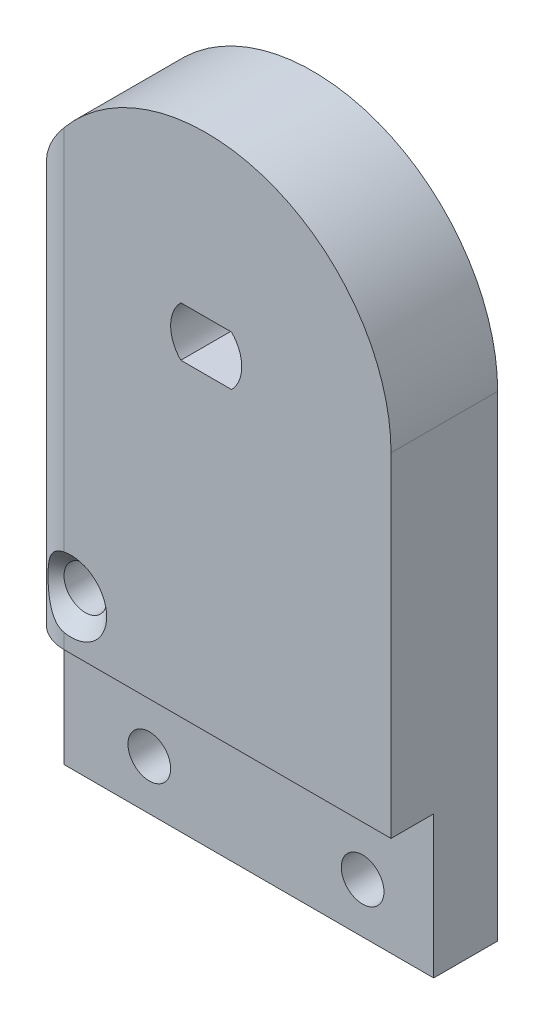
ISO-10303-21;
HEADER;
FILE_DESCRIPTION(('STEP AP214'),'2;1');
FILE_NAME('part.step','',(''),(''),'','','');
FILE_SCHEMA(('AUTOMOTIVE_DESIGN { 1 0 10303 214 1 1 1 1 }'));
ENDSEC;
DATA;
#1=APPLICATION_CONTEXT('core data for automotive mechanical design processes');
#2=APPLICATION_PROTOCOL_DEFINITION('international standard','automotive_design',2000,#1);
#3=PRODUCT_CONTEXT('',#1,'mechanical');
#4=PRODUCT('Part','Part','',(#3));
#5=PRODUCT_RELATED_PRODUCT_CATEGORY('part','',(#4));
#6=PRODUCT_DEFINITION_FORMATION('','',#4);
#7=PRODUCT_DEFINITION_CONTEXT('part definition',#1,'design');
#8=PRODUCT_DEFINITION('design','',#6,#7);
#9=PRODUCT_DEFINITION_SHAPE('','',#8);
#10=(LENGTH_UNIT() NAMED_UNIT(*) SI_UNIT(.MILLI.,.METRE.));
#11=(NAMED_UNIT(*) PLANE_ANGLE_UNIT() SI_UNIT($,.RADIAN.));
#12=(NAMED_UNIT(*) SI_UNIT($,.STERADIAN.) SOLID_ANGLE_UNIT());
#13=UNCERTAINTY_MEASURE_WITH_UNIT(LENGTH_MEASURE(1.E-05),#10,'distance_accuracy_value','');
#14=(GEOMETRIC_REPRESENTATION_CONTEXT(3) GLOBAL_UNCERTAINTY_ASSIGNED_CONTEXT((#13)) GLOBAL_UNIT_ASSIGNED_CONTEXT((#10,
#11,#12)) REPRESENTATION_CONTEXT('',''));
#15=CARTESIAN_POINT('',(0.,0.,0.));
#16=DIRECTION('',(0.,0.,1.));
#17=DIRECTION('',(1.,0.,0.));
#18=AXIS2_PLACEMENT_3D('',#15,#16,#17);
#19=CARTESIAN_POINT('',(24.2641007815364,-54.,8.));
#20=DIRECTION('',(0.,1.,0.));
#21=DIRECTION('',(0.,0.,1.));
#22=AXIS2_PLACEMENT_3D('',#19,#20,#21);
#23=PLANE('',#22);
#24=DIRECTION('',(0.,0.,-1.));
#25=VECTOR('',#24,1.);
#26=CARTESIAN_POINT('',(24.2641007815364,-54.,8.));
#27=LINE('',#26,#25);
#28=CARTESIAN_POINT('',(24.2641007815364,-54.,5.));
#29=VERTEX_POINT('',#28);
#30=CARTESIAN_POINT('',(24.2641007815364,-54.,0.5));
#31=VERTEX_POINT('',#30);
#32=EDGE_CURVE('E144',#29,#31,#27,.T.);
#33=ORIENTED_EDGE('',*,*,#32,.T.);
#34=DIRECTION('',(1.,0.,0.));
#35=VECTOR('',#34,1.);
#36=CARTESIAN_POINT('',(24.2641007815364,-54.,0.5));
#37=LINE('',#36,#35);
#38=CARTESIAN_POINT('',(50.2641007815363,-54.,0.5));
#39=VERTEX_POINT('',#38);
#40=EDGE_CURVE('E130',#31,#39,#37,.T.);
#41=ORIENTED_EDGE('',*,*,#40,.T.);
#42=DIRECTION('',(0.,0.,-1.));
#43=VECTOR('',#42,1.);
#44=CARTESIAN_POINT('',(50.2641007815364,-54.,8.));
#45=LINE('',#44,#43);
#46=CARTESIAN_POINT('',(50.2641007815364,-54.,5.));
#47=VERTEX_POINT('',#46);
#48=EDGE_CURVE('E142',#47,#39,#45,.T.);
#49=ORIENTED_EDGE('',*,*,#48,.F.);
#50=DIRECTION('',(1.,0.,0.));
#51=VECTOR('',#50,1.);
#52=CARTESIAN_POINT('',(50.2641007815364,-54.,5.));
#53=LINE('',#52,#51);
#54=EDGE_CURVE('E252',#29,#47,#53,.T.);
#55=ORIENTED_EDGE('',*,*,#54,.F.);
#56=EDGE_LOOP('',(#33,#41,#49,#55));
#57=FACE_BOUND('',#56,.T.);
#58=ADVANCED_FACE('F37',(#57),#23,.F.);
#59=CARTESIAN_POINT('',(50.2641007815364,-54.,8.));
#60=DIRECTION('',(-1.,0.,0.));
#61=DIRECTION('',(0.,0.,1.));
#62=AXIS2_PLACEMENT_3D('',#59,#60,#61);
#63=PLANE('',#62);
#64=ORIENTED_EDGE('',*,*,#48,.T.);
#65=DIRECTION('',(0.,-1.,0.));
#66=VECTOR('',#65,1.);
#67=CARTESIAN_POINT('',(50.2641007815364,-4.,0.5));
#68=LINE('',#67,#66);
#69=CARTESIAN_POINT('',(50.2641007815364,-20.5159979477303,0.5));
#70=VERTEX_POINT('',#69);
#71=EDGE_CURVE('E125',#70,#39,#68,.T.);
#72=ORIENTED_EDGE('',*,*,#71,.F.);
#73=DIRECTION('',(0.,0.,1.));
#74=VECTOR('',#73,1.);
#75=CARTESIAN_POINT('',(50.2641007815364,-20.5159979477303,-62.5689387206191));
#76=LINE('',#75,#74);
#77=CARTESIAN_POINT('',(50.2641007815364,-20.5159979477303,8.));
#78=VERTEX_POINT('',#77);
#79=EDGE_CURVE('E244',#70,#78,#76,.T.);
#80=ORIENTED_EDGE('',*,*,#79,.T.);
#81=DIRECTION('',(0.,1.,0.));
#82=VECTOR('',#81,1.);
#83=CARTESIAN_POINT('',(50.2641007815364,-54.,8.));
#84=LINE('',#83,#82);
#85=CARTESIAN_POINT('',(50.2641007815364,-44.,8.));
#86=VERTEX_POINT('',#85);
#87=EDGE_CURVE('E153',#86,#78,#84,.T.);
#88=ORIENTED_EDGE('',*,*,#87,.F.);
#89=DIRECTION('',(0.,0.,1.));
#90=VECTOR('',#89,1.);
#91=CARTESIAN_POINT('',(50.2641007815364,-44.,5.));
#92=LINE('',#91,#90);
#93=CARTESIAN_POINT('',(50.2641007815364,-44.,5.));
#94=VERTEX_POINT('',#93);
#95=EDGE_CURVE('E248',#94,#86,#92,.T.);
#96=ORIENTED_EDGE('',*,*,#95,.F.);
#97=DIRECTION('',(0.,1.,0.));
#98=VECTOR('',#97,1.);
#99=CARTESIAN_POINT('',(50.2641007815364,-54.,5.));
#100=LINE('',#99,#98);
#101=EDGE_CURVE('E152',#47,#94,#100,.T.);
#102=ORIENTED_EDGE('',*,*,#101,.F.);
#103=EDGE_LOOP('',(#64,#72,#80,#88,#96,#102));
#104=FACE_BOUND('',#103,.T.);
#105=ADVANCED_FACE('F149',(#104),#63,.F.);
#106=CARTESIAN_POINT('',(24.2641007815364,-54.,8.));
#107=DIRECTION('',(1.,0.,0.));
#108=DIRECTION('',(0.,1.,0.));
#109=AXIS2_PLACEMENT_3D('',#106,#107,#108);
#110=PLANE('',#109);
#111=DIRECTION('',(0.,1.,0.));
#112=VECTOR('',#111,1.);
#113=CARTESIAN_POINT('',(24.2641007815364,-37.,0.5));
#114=LINE('',#113,#112);
#115=CARTESIAN_POINT('',(24.2641007815364,-20.5159979477303,0.5));
#116=VERTEX_POINT('',#115);
#117=EDGE_CURVE('E137',#31,#116,#114,.T.);
#118=ORIENTED_EDGE('',*,*,#117,.F.);
#119=ORIENTED_EDGE('',*,*,#32,.F.);
#120=DIRECTION('',(0.,-1.,0.));
#121=VECTOR('',#120,1.);
#122=CARTESIAN_POINT('',(24.2641007815364,-54.,5.));
#123=LINE('',#122,#121);
#124=CARTESIAN_POINT('',(24.2641007815364,-44.,5.));
#125=VERTEX_POINT('',#124);
#126=EDGE_CURVE('E164',#29,#125,#123,.F.);
#127=ORIENTED_EDGE('',*,*,#126,.T.);
#128=CARTESIAN_POINT('',(24.2641007815364,-20.5159979477303,5.));
#129=VERTEX_POINT('',#128);
#130=EDGE_CURVE('E163',#125,#129,#123,.F.);
#131=ORIENTED_EDGE('',*,*,#130,.T.);
#132=DIRECTION('',(0.,0.,1.));
#133=VECTOR('',#132,1.);
#134=CARTESIAN_POINT('',(24.2641007815364,-20.5159979477303,-62.5689387206191));
#135=LINE('',#134,#133);
#136=EDGE_CURVE('E241',#116,#129,#135,.T.);
#137=ORIENTED_EDGE('',*,*,#136,.F.);
#138=EDGE_LOOP('',(#118,#119,#127,#131,#137));
#139=FACE_BOUND('',#138,.T.);
#140=ADVANCED_FACE('F228',(#139),#110,.F.);
#141=CARTESIAN_POINT('',(30.2641007815364,-50.5,-32.2426406871193));
#142=DIRECTION('',(0.,0.,1.));
#143=DIRECTION('',(1.,0.,0.));
#144=AXIS2_PLACEMENT_3D('',#141,#142,#143);
#145=CYLINDRICAL_SURFACE('',#144,1.5);
#146=CARTESIAN_POINT('',(30.2641007815364,-50.5,0.5));
#147=DIRECTION('',(0.,0.,1.));
#148=DIRECTION('',(1.,0.,0.));
#149=AXIS2_PLACEMENT_3D('',#146,#147,#148);
#150=CIRCLE('',#149,1.5);
#151=CARTESIAN_POINT('',(31.7641007815364,-50.5,0.5));
#152=VERTEX_POINT('',#151);
#153=EDGE_CURVE('E146',#152,#152,#150,.F.);
#154=ORIENTED_EDGE('',*,*,#153,.T.);
#155=EDGE_LOOP('',(#154));
#156=FACE_BOUND('',#155,.T.);
#157=CARTESIAN_POINT('',(30.2641007815364,-50.5,5.));
#158=DIRECTION('',(0.,0.,1.));
#159=DIRECTION('',(1.,0.,0.));
#160=AXIS2_PLACEMENT_3D('',#157,#158,#159);
#161=CIRCLE('',#160,1.5);
#162=CARTESIAN_POINT('',(31.7641007815364,-50.5,5.));
#163=VERTEX_POINT('',#162);
#164=EDGE_CURVE('E145',#163,#163,#161,.T.);
#165=ORIENTED_EDGE('',*,*,#164,.T.);
#166=EDGE_LOOP('',(#165));
#167=FACE_BOUND('',#166,.T.);
#168=ADVANCED_FACE('F230',(#156,#167),#145,.F.);
#169=CARTESIAN_POINT('',(45.2641007815364,-50.5,-32.2426406871193));
#170=DIRECTION('',(0.,0.,1.));
#171=DIRECTION('',(1.,0.,0.));
#172=AXIS2_PLACEMENT_3D('',#169,#170,#171);
#173=CYLINDRICAL_SURFACE('',#172,1.50000000000001);
#174=CARTESIAN_POINT('',(45.2641007815364,-50.5,0.5));
#175=DIRECTION('',(0.,0.,1.));
#176=DIRECTION('',(1.,0.,0.));
#177=AXIS2_PLACEMENT_3D('',#174,#175,#176);
#178=CIRCLE('',#177,1.50000000000001);
#179=CARTESIAN_POINT('',(46.7641007815364,-50.5,0.5));
#180=VERTEX_POINT('',#179);
#181=EDGE_CURVE('E267',#180,#180,#178,.F.);
#182=ORIENTED_EDGE('',*,*,#181,.T.);
#183=EDGE_LOOP('',(#182));
#184=FACE_BOUND('',#183,.T.);
#185=CARTESIAN_POINT('',(45.2641007815364,-50.5,5.));
#186=DIRECTION('',(0.,0.,1.));
#187=DIRECTION('',(1.,0.,0.));
#188=AXIS2_PLACEMENT_3D('',#185,#186,#187);
#189=CIRCLE('',#188,1.50000000000001);
#190=CARTESIAN_POINT('',(46.7641007815364,-50.5,5.));
#191=VERTEX_POINT('',#190);
#192=EDGE_CURVE('E256',#191,#191,#189,.T.);
#193=ORIENTED_EDGE('',*,*,#192,.T.);
#194=EDGE_LOOP('',(#193));
#195=FACE_BOUND('',#194,.T.);
#196=ADVANCED_FACE('F236',(#184,#195),#173,.F.);
#197=CARTESIAN_POINT('',(27.7641007815364,-40.5,-32.2426406871193));
#198=DIRECTION('',(0.,0.,1.));
#199=DIRECTION('',(1.,0.,0.));
#200=AXIS2_PLACEMENT_3D('',#197,#198,#199);
#201=CYLINDRICAL_SURFACE('',#200,1.5);
#202=CARTESIAN_POINT('',(27.7641007815364,-40.5,0.5));
#203=DIRECTION('',(0.,0.,1.));
#204=DIRECTION('',(1.,0.,0.));
#205=AXIS2_PLACEMENT_3D('',#202,#203,#204);
#206=CIRCLE('',#205,1.5);
#207=CARTESIAN_POINT('',(29.2641007815364,-40.5,0.5));
#208=VERTEX_POINT('',#207);
#209=EDGE_CURVE('E43',#208,#208,#206,.F.);
#210=ORIENTED_EDGE('',*,*,#209,.T.);
#211=EDGE_LOOP('',(#210));
#212=FACE_BOUND('',#211,.T.);
#213=CARTESIAN_POINT('',(27.7641007815364,-40.5,7.00000000000001));
#214=DIRECTION('',(0.,0.,-1.));
#215=DIRECTION('',(-1.,0.,0.));
#216=AXIS2_PLACEMENT_3D('',#213,#214,#215);
#217=CIRCLE('',#216,1.5);
#218=CARTESIAN_POINT('',(26.2641007815364,-40.5,7.00000000000001));
#219=VERTEX_POINT('',#218);
#220=EDGE_CURVE('E173',#219,#219,#217,.F.);
#221=ORIENTED_EDGE('',*,*,#220,.T.);
#222=EDGE_LOOP('',(#221));
#223=FACE_BOUND('',#222,.T.);
#224=ADVANCED_FACE('F225',(#212,#223),#201,.F.);
#225=CARTESIAN_POINT('',(0.,0.,8.));
#226=DIRECTION('',(0.,0.,-1.));
#227=DIRECTION('',(-1.,0.,0.));
#228=AXIS2_PLACEMENT_3D('',#225,#226,#227);
#229=PLANE('',#228);
#230=CARTESIAN_POINT('',(37.2641007815364,-20.5159979477303,8.));
#231=DIRECTION('',(0.,0.,1.));
#232=DIRECTION('',(1.,0.,0.));
#233=AXIS2_PLACEMENT_3D('',#230,#231,#232);
#234=CIRCLE('',#233,2.5000000003716);
#235=CARTESIAN_POINT('',(39.0494578886773,-22.2659979482559,8.));
#236=VERTEX_POINT('',#235);
#237=CARTESIAN_POINT('',(39.0494578889322,-18.7659979474649,8.));
#238=VERTEX_POINT('',#237);
#239=EDGE_CURVE('E426',#236,#238,#234,.T.);
#240=ORIENTED_EDGE('',*,*,#239,.F.);
#241=DIRECTION('',(1.,0.,0.));
#242=VECTOR('',#241,1.);
#243=CARTESIAN_POINT('',(39.0494578886773,-22.2659979482559,8.));
#244=LINE('',#243,#242);
#245=CARTESIAN_POINT('',(35.4787436749158,-22.2659979482559,8.));
#246=VERTEX_POINT('',#245);
#247=EDGE_CURVE('E428',#246,#236,#244,.T.);
#248=ORIENTED_EDGE('',*,*,#247,.F.);
#249=CARTESIAN_POINT('',(37.2641007815364,-20.5159979477303,8.));
#250=DIRECTION('',(0.,0.,1.));
#251=DIRECTION('',(1.,0.,0.));
#252=AXIS2_PLACEMENT_3D('',#249,#250,#251);
#253=CIRCLE('',#252,2.50000000000003);
#254=CARTESIAN_POINT('',(35.4787436746608,-18.7659979474649,8.));
#255=VERTEX_POINT('',#254);
#256=EDGE_CURVE('E435',#255,#246,#253,.T.);
#257=ORIENTED_EDGE('',*,*,#256,.F.);
#258=DIRECTION('',(-1.,0.,0.));
#259=VECTOR('',#258,1.);
#260=CARTESIAN_POINT('',(35.4787436746608,-18.7659979474649,8.));
#261=LINE('',#260,#259);
#262=EDGE_CURVE('E429',#238,#255,#261,.T.);
#263=ORIENTED_EDGE('',*,*,#262,.F.);
#264=EDGE_LOOP('',(#240,#248,#257,#263));
#265=FACE_BOUND('',#264,.T.);
#266=DIRECTION('',(0.,-1.,0.));
#267=VECTOR('',#266,1.);
#268=CARTESIAN_POINT('',(27.2641007815364,0.,8.));
#269=LINE('',#268,#267);
#270=CARTESIAN_POINT('',(27.2641007815364,-12.2093740848123,8.));
#271=VERTEX_POINT('',#270);
#272=CARTESIAN_POINT('',(27.2641007815364,-38.0505102572168,8.));
#273=VERTEX_POINT('',#272);
#274=EDGE_CURVE('E161',#271,#273,#269,.T.);
#275=ORIENTED_EDGE('',*,*,#274,.T.);
#276=CARTESIAN_POINT('',(27.7641007815364,-40.5,8.));
#277=DIRECTION('',(0.,0.,-1.));
#278=DIRECTION('',(-1.,0.,0.));
#279=AXIS2_PLACEMENT_3D('',#276,#277,#278);
#280=CIRCLE('',#279,2.5);
#281=CARTESIAN_POINT('',(27.2641007815364,-42.9494897427831,8.));
#282=VERTEX_POINT('',#281);
#283=EDGE_CURVE('E11',#273,#282,#280,.T.);
#284=ORIENTED_EDGE('',*,*,#283,.T.);
#285=CARTESIAN_POINT('',(27.2641007815364,-44.,8.));
#286=VERTEX_POINT('',#285);
#287=EDGE_CURVE('E155',#282,#286,#269,.T.);
#288=ORIENTED_EDGE('',*,*,#287,.T.);
#289=DIRECTION('',(-1.,0.,0.));
#290=VECTOR('',#289,1.);
#291=CARTESIAN_POINT('',(50.2641007815364,-44.,8.));
#292=LINE('',#291,#290);
#293=EDGE_CURVE('E253',#86,#286,#292,.T.);
#294=ORIENTED_EDGE('',*,*,#293,.F.);
#295=ORIENTED_EDGE('',*,*,#87,.T.);
#296=CARTESIAN_POINT('',(37.2641007815364,-20.5159979477303,8.));
#297=DIRECTION('',(0.,0.,-1.));
#298=DIRECTION('',(1.,0.,0.));
#299=AXIS2_PLACEMENT_3D('',#296,#297,#298);
#300=CIRCLE('',#299,13.);
#301=EDGE_CURVE('E245',#271,#78,#300,.T.);
#302=ORIENTED_EDGE('',*,*,#301,.F.);
#303=EDGE_LOOP('',(#275,#284,#288,#294,#295,#302));
#304=FACE_BOUND('',#303,.T.);
#305=ADVANCED_FACE('F208',(#265,#304),#229,.F.);
#306=CARTESIAN_POINT('',(0.,0.,0.5));
#307=DIRECTION('',(0.,0.,-1.));
#308=DIRECTION('',(-1.,0.,0.));
#309=AXIS2_PLACEMENT_3D('',#306,#307,#308);
#310=PLANE('',#309);
#311=ORIENTED_EDGE('',*,*,#71,.T.);
#312=ORIENTED_EDGE('',*,*,#40,.F.);
#313=ORIENTED_EDGE('',*,*,#117,.T.);
#314=CARTESIAN_POINT('',(37.2641007815364,-20.5159979477303,0.5));
#315=DIRECTION('',(0.,0.,-1.));
#316=DIRECTION('',(-1.,0.,0.));
#317=AXIS2_PLACEMENT_3D('',#314,#315,#316);
#318=CIRCLE('',#317,13.);
#319=EDGE_CURVE('E132',#70,#116,#318,.F.);
#320=ORIENTED_EDGE('',*,*,#319,.F.);
#321=EDGE_LOOP('',(#311,#312,#313,#320));
#322=FACE_BOUND('',#321,.T.);
#323=DIRECTION('',(1.,0.,0.));
#324=VECTOR('',#323,1.);
#325=CARTESIAN_POINT('',(35.4787436746608,-18.7659979474649,0.5));
#326=LINE('',#325,#324);
#327=CARTESIAN_POINT('',(35.4787436746608,-18.7659979474649,0.5));
#328=VERTEX_POINT('',#327);
#329=CARTESIAN_POINT('',(39.0494578889322,-18.7659979474649,0.5));
#330=VERTEX_POINT('',#329);
#331=EDGE_CURVE('E438',#328,#330,#326,.T.);
#332=ORIENTED_EDGE('',*,*,#331,.F.);
#333=CARTESIAN_POINT('',(37.2641007815364,-20.5159979477303,0.5));
#334=DIRECTION('',(0.,0.,-1.));
#335=DIRECTION('',(-1.,0.,0.));
#336=AXIS2_PLACEMENT_3D('',#333,#334,#335);
#337=CIRCLE('',#336,2.50000000000003);
#338=CARTESIAN_POINT('',(35.4787436749158,-22.2659979482559,0.5));
#339=VERTEX_POINT('',#338);
#340=EDGE_CURVE('E136',#339,#328,#337,.T.);
#341=ORIENTED_EDGE('',*,*,#340,.F.);
#342=DIRECTION('',(-1.,0.,0.));
#343=VECTOR('',#342,1.);
#344=CARTESIAN_POINT('',(39.0494578886773,-22.2659979482559,0.5));
#345=LINE('',#344,#343);
#346=CARTESIAN_POINT('',(39.0494578886773,-22.2659979482559,0.5));
#347=VERTEX_POINT('',#346);
#348=EDGE_CURVE('E167',#347,#339,#345,.T.);
#349=ORIENTED_EDGE('',*,*,#348,.F.);
#350=CARTESIAN_POINT('',(37.2641007815364,-20.5159979477303,0.5));
#351=DIRECTION('',(0.,0.,-1.));
#352=DIRECTION('',(-1.,0.,0.));
#353=AXIS2_PLACEMENT_3D('',#350,#351,#352);
#354=CIRCLE('',#353,2.5000000003716);
#355=EDGE_CURVE('E433',#330,#347,#354,.T.);
#356=ORIENTED_EDGE('',*,*,#355,.F.);
#357=EDGE_LOOP('',(#332,#341,#349,#356));
#358=FACE_BOUND('',#357,.T.);
#359=ORIENTED_EDGE('',*,*,#181,.F.);
#360=EDGE_LOOP('',(#359));
#361=FACE_BOUND('',#360,.T.);
#362=ORIENTED_EDGE('',*,*,#209,.F.);
#363=EDGE_LOOP('',(#362));
#364=FACE_BOUND('',#363,.T.);
#365=ORIENTED_EDGE('',*,*,#153,.F.);
#366=EDGE_LOOP('',(#365));
#367=FACE_BOUND('',#366,.T.);
#368=ADVANCED_FACE('F127',(#322,#358,#361,#364,#367),#310,.T.);
#369=CARTESIAN_POINT('',(37.2641007815364,-20.5159979477303,8.));
#370=DIRECTION('',(0.,0.,-1.));
#371=DIRECTION('',(-1.,0.,0.));
#372=AXIS2_PLACEMENT_3D('',#369,#370,#371);
#373=CYLINDRICAL_SURFACE('',#372,2.5000000003716);
#374=DIRECTION('',(0.,0.,-1.));
#375=VECTOR('',#374,1.);
#376=CARTESIAN_POINT('',(39.0494578889322,-18.7659979474649,8.));
#377=LINE('',#376,#375);
#378=EDGE_CURVE('E157',#238,#330,#377,.T.);
#379=ORIENTED_EDGE('',*,*,#378,.T.);
#380=ORIENTED_EDGE('',*,*,#355,.T.);
#381=DIRECTION('',(0.,0.,-1.));
#382=VECTOR('',#381,1.);
#383=CARTESIAN_POINT('',(39.0494578886773,-22.2659979482559,8.));
#384=LINE('',#383,#382);
#385=EDGE_CURVE('E445',#236,#347,#384,.T.);
#386=ORIENTED_EDGE('',*,*,#385,.F.);
#387=ORIENTED_EDGE('',*,*,#239,.T.);
#388=EDGE_LOOP('',(#379,#380,#386,#387));
#389=FACE_BOUND('',#388,.T.);
#390=ADVANCED_FACE('F207',(#389),#373,.F.);
#391=CARTESIAN_POINT('',(35.4787436746608,-18.7659979474649,8.));
#392=DIRECTION('',(0.,-1.,0.));
#393=DIRECTION('',(1.,0.,0.));
#394=AXIS2_PLACEMENT_3D('',#391,#392,#393);
#395=PLANE('',#394);
#396=DIRECTION('',(0.,0.,-1.));
#397=VECTOR('',#396,1.);
#398=CARTESIAN_POINT('',(35.4787436746608,-18.7659979474649,8.));
#399=LINE('',#398,#397);
#400=EDGE_CURVE('E451',#255,#328,#399,.T.);
#401=ORIENTED_EDGE('',*,*,#400,.T.);
#402=ORIENTED_EDGE('',*,*,#331,.T.);
#403=ORIENTED_EDGE('',*,*,#378,.F.);
#404=ORIENTED_EDGE('',*,*,#262,.T.);
#405=EDGE_LOOP('',(#401,#402,#403,#404));
#406=FACE_BOUND('',#405,.T.);
#407=ADVANCED_FACE('F215',(#406),#395,.T.);
#408=CARTESIAN_POINT('',(37.2641007815364,-20.5159979477303,8.));
#409=DIRECTION('',(0.,0.,-1.));
#410=DIRECTION('',(-1.,0.,0.));
#411=AXIS2_PLACEMENT_3D('',#408,#409,#410);
#412=CYLINDRICAL_SURFACE('',#411,2.50000000000003);
#413=DIRECTION('',(0.,0.,-1.));
#414=VECTOR('',#413,1.);
#415=CARTESIAN_POINT('',(35.4787436749158,-22.2659979482559,8.));
#416=LINE('',#415,#414);
#417=EDGE_CURVE('E448',#246,#339,#416,.T.);
#418=ORIENTED_EDGE('',*,*,#417,.T.);
#419=ORIENTED_EDGE('',*,*,#340,.T.);
#420=ORIENTED_EDGE('',*,*,#400,.F.);
#421=ORIENTED_EDGE('',*,*,#256,.T.);
#422=EDGE_LOOP('',(#418,#419,#420,#421));
#423=FACE_BOUND('',#422,.T.);
#424=ADVANCED_FACE('F211',(#423),#412,.F.);
#425=CARTESIAN_POINT('',(39.0494578886773,-22.2659979482559,8.));
#426=DIRECTION('',(0.,1.,0.));
#427=DIRECTION('',(-1.,0.,0.));
#428=AXIS2_PLACEMENT_3D('',#425,#426,#427);
#429=PLANE('',#428);
#430=ORIENTED_EDGE('',*,*,#385,.T.);
#431=ORIENTED_EDGE('',*,*,#348,.T.);
#432=ORIENTED_EDGE('',*,*,#417,.F.);
#433=ORIENTED_EDGE('',*,*,#247,.T.);
#434=EDGE_LOOP('',(#430,#431,#432,#433));
#435=FACE_BOUND('',#434,.T.);
#436=ADVANCED_FACE('F185',(#435),#429,.T.);
#437=CARTESIAN_POINT('',(27.2641007815364,0.,5.));
#438=DIRECTION('',(0.,-1.,0.));
#439=DIRECTION('',(1.,0.,0.));
#440=AXIS2_PLACEMENT_3D('',#437,#438,#439);
#441=CYLINDRICAL_SURFACE('',#440,3.);
#442=CARTESIAN_POINT('',(27.2641007815364,-42.9494897427831,8.));
#443=CARTESIAN_POINT('',(27.2228042420028,-42.9410688852454,8.00000510962517));
#444=CARTESIAN_POINT('',(27.18192921198,-42.9307578407339,7.99914696604244));
#445=CARTESIAN_POINT('',(27.1013619271675,-42.9066193387689,7.99585252601034));
#446=CARTESIAN_POINT('',(27.0616679439838,-42.8927973340041,7.99341866772501));
#447=CARTESIAN_POINT('',(26.945580015456,-42.8467698005226,7.98404406729823));
#448=CARTESIAN_POINT('',(26.871211835951,-42.809795505405,7.97502324276865));
#449=CARTESIAN_POINT('',(26.7134156587015,-42.7159177647708,7.95034099175041));
#450=CARTESIAN_POINT('',(26.6317362994732,-42.6563991283649,7.93363977413291));
#451=CARTESIAN_POINT('',(26.479134694124,-42.5253824920424,7.8965552729928));
#452=CARTESIAN_POINT('',(26.4082681308509,-42.4538262256257,7.87615404062422));
#453=CARTESIAN_POINT('',(26.2526238954382,-42.2730460740432,7.82593722012205));
#454=CARTESIAN_POINT('',(26.1727271782463,-42.1598137359316,7.79548008519227));
#455=CARTESIAN_POINT('',(26.0322810351468,-41.9216151649368,7.73649719707641));
#456=CARTESIAN_POINT('',(25.9717448523892,-41.7966409755772,7.7079727763882));
#457=CARTESIAN_POINT('',(25.8677132205546,-41.5349220694238,7.65585613282243));
#458=CARTESIAN_POINT('',(25.8247047417536,-41.3979550240992,7.6324123795513));
#459=CARTESIAN_POINT('',(25.7577526164479,-41.1184521858042,7.59468920605873));
#460=CARTESIAN_POINT('',(25.7337689168925,-40.9759287584547,7.58039054495552));
#461=CARTESIAN_POINT('',(25.7136848135025,-40.7771169404184,7.56831377110278));
#462=CARTESIAN_POINT('',(25.7095095351538,-40.7218146454419,7.56578502705132));
#463=CARTESIAN_POINT('',(25.7039410648894,-40.6110098975032,7.56240436593503));
#464=CARTESIAN_POINT('',(25.7025479400629,-40.5555074397467,7.5615524893064));
#465=CARTESIAN_POINT('',(25.7025480100395,-40.4200016808437,7.56155327904634));
#466=CARTESIAN_POINT('',(25.705441783302,-40.3399930135496,7.56332385802685));
#467=CARTESIAN_POINT('',(25.7170149399386,-40.1805167345033,7.57032484349079));
#468=CARTESIAN_POINT('',(25.7256971152361,-40.1010494025482,7.57555691955085));
#469=CARTESIAN_POINT('',(25.7488722819235,-39.9430407260665,7.58925968936859));
#470=CARTESIAN_POINT('',(25.7633796769019,-39.8645021773159,7.59773840843197));
#471=CARTESIAN_POINT('',(25.7982120202334,-39.7090839082713,7.61754930164792));
#472=CARTESIAN_POINT('',(25.8185391186698,-39.63220481237,7.62888253020951));
#473=CARTESIAN_POINT('',(25.8885669659032,-39.4039487882133,7.66660480345272));
#474=CARTESIAN_POINT('',(25.9471937616035,-39.2557925774469,7.69663539633954));
#475=CARTESIAN_POINT('',(26.0889824292094,-38.973005513211,7.76136877841134));
#476=CARTESIAN_POINT('',(26.172091987382,-38.8383466331866,7.79606152062238));
#477=CARTESIAN_POINT('',(26.3296602989518,-38.6341171402949,7.85149531428581));
#478=CARTESIAN_POINT('',(26.3963223133217,-38.5586543301025,7.87273250481466));
#479=CARTESIAN_POINT('',(26.5408111440867,-38.4183524043624,7.91246432151207));
#480=CARTESIAN_POINT('',(26.6186233743174,-38.3534996430108,7.93096246746753));
#481=CARTESIAN_POINT('',(26.7674602436414,-38.2502492774154,7.9593592226767));
#482=CARTESIAN_POINT('',(26.8364200589344,-38.2091581888375,7.97024974222164));
#483=CARTESIAN_POINT('',(26.9802595258056,-38.1379818905214,7.98741227580825));
#484=CARTESIAN_POINT('',(27.0551203516607,-38.1078632768168,7.99369836737327));
#485=CARTESIAN_POINT('',(27.1537212504556,-38.0775625383519,7.99804845348774));
#486=CARTESIAN_POINT('',(27.1756053202069,-38.071405365755,7.99877573554956));
#487=CARTESIAN_POINT('',(27.2196529453488,-38.0601542699607,7.99975125702629));
#488=CARTESIAN_POINT('',(27.2418164703853,-38.0550602323246,7.99999954802475));
#489=CARTESIAN_POINT('',(27.2641007815364,-38.0505102572168,8.00000000000001));
#490=B_SPLINE_CURVE_WITH_KNOTS('',3,(#442,#443,#444,#445,#446,#447,#448,#449,#450,#451,#452,
#453,#454,#455,#456,#457,#458,#459,#460,#461,#462,#463,#464,#465,#466,#467,#468,#469,#470,#471,
#472,#473,#474,#475,#476,#477,#478,#479,#480,#481,#482,#483,#484,#485,#486,#487,#488,#489),
.UNSPECIFIED.,.F.,.F.,(4,2,2,2,2,2,2,2,2,2,2,2,2,2,2,2,2,2,2,2,2,2,2,4),(0.,0.126326733408832,
0.252458462273411,0.501797953963049,0.807465096366258,1.11465675256891,1.53807255400892,
1.96177736735895,2.39656120367785,2.8304272378117,2.99690799160027,3.16339275987856,
3.40333359822654,3.643390251191,3.88404416601741,4.12478710515817,4.60879704620276,
5.09178018547594,5.39957396367403,5.70696871586454,5.94911841437486,6.1905246413024,
6.25873766963265,6.32694335154773),.UNSPECIFIED.);
#491=EDGE_CURVE('E48',#282,#273,#490,.T.);
#492=ORIENTED_EDGE('',*,*,#491,.T.);
#493=ORIENTED_EDGE('',*,*,#274,.F.);
#494=CARTESIAN_POINT('',(27.2641007815364,-12.2093740848123,8.));
#495=CARTESIAN_POINT('',(27.1973049051906,-12.2897842724645,7.99999514862239));
#496=CARTESIAN_POINT('',(27.1314980357586,-12.3709826228228,7.99776980815036));
#497=CARTESIAN_POINT('',(27.0019796539588,-12.5347850051342,7.98923220129225));
#498=CARTESIAN_POINT('',(26.9382675029312,-12.6173885967658,7.98292119296041));
#499=CARTESIAN_POINT('',(26.750641733987,-12.8667894944125,7.9584213011743));
#500=CARTESIAN_POINT('',(26.6299677524984,-13.035503480434,7.93466264233202));
#501=CARTESIAN_POINT('',(26.3987048470992,-13.3756081610308,7.8749340465294));
#502=CARTESIAN_POINT('',(26.2880460003661,-13.5469686108888,7.8390586634014));
#503=CARTESIAN_POINT('',(26.0758630713359,-13.8929656900783,7.75699691414019));
#504=CARTESIAN_POINT('',(25.9743450631766,-14.0676044060544,7.71080376171419));
#505=CARTESIAN_POINT('',(25.7238018290738,-14.5224302617938,7.58021702378969));
#506=CARTESIAN_POINT('',(25.5817311771909,-14.8045915403346,7.4892855917966));
#507=CARTESIAN_POINT('',(25.3203221642993,-15.3735976367171,7.29099150080066));
#508=CARTESIAN_POINT('',(25.2009924117963,-15.6604441837202,7.18362264708196));
#509=CARTESIAN_POINT('',(24.9839591068798,-16.238853358565,6.95596423225799));
#510=CARTESIAN_POINT('',(24.8863584196065,-16.5304316888519,6.83561705667003));
#511=CARTESIAN_POINT('',(24.7128945653175,-17.1159347281132,6.58570811366048));
#512=CARTESIAN_POINT('',(24.6370265184561,-17.4098588950943,6.45614842298477));
#513=CARTESIAN_POINT('',(24.4691752728013,-18.167627648702,6.11466443904743));
#514=CARTESIAN_POINT('',(24.3926817062925,-18.6327704900423,5.89791017036676));
#515=CARTESIAN_POINT('',(24.2905849825227,-19.5638518527441,5.45735246315833));
#516=CARTESIAN_POINT('',(24.2648529368461,-20.0297853446372,5.23356834734692));
#517=CARTESIAN_POINT('',(24.2641062034816,-20.5022948028889,5.00658277672409));
#518=CARTESIAN_POINT('',(24.2641007870804,-20.5091464071625,5.00329137244989));
#519=CARTESIAN_POINT('',(24.2641007815364,-20.5159979477303,5.));
#520=B_SPLINE_CURVE_WITH_KNOTS('',3,(#494,#495,#496,#497,#498,#499,#500,#501,#502,#503,#504,
#505,#506,#507,#508,#509,#510,#511,#512,#513,#514,#515,#516,#517,#518,#519),.UNSPECIFIED.,.F.,
.F.,(4,2,2,2,2,2,2,2,2,2,2,2,4),(0.,0.313529968759423,0.626963441613278,1.25256173228844,
1.87338677642541,2.4946213637476,3.47931562976942,4.46438191191313,5.4540167545284,
6.44342921009862,7.99716851464404,9.54695762074902,9.56976113504105),.UNSPECIFIED.);
#521=EDGE_CURVE('E189',#129,#271,#520,.F.);
#522=ORIENTED_EDGE('',*,*,#521,.F.);
#523=ORIENTED_EDGE('',*,*,#130,.F.);
#524=CARTESIAN_POINT('',(27.2641007815364,-44.,5.));
#525=DIRECTION('',(0.,1.,0.));
#526=DIRECTION('',(-1.,0.,0.));
#527=AXIS2_PLACEMENT_3D('',#524,#525,#526);
#528=CIRCLE('',#527,3.);
#529=EDGE_CURVE('E170',#286,#125,#528,.F.);
#530=ORIENTED_EDGE('',*,*,#529,.F.);
#531=ORIENTED_EDGE('',*,*,#287,.F.);
#532=EDGE_LOOP('',(#492,#493,#522,#523,#530,#531));
#533=FACE_BOUND('',#532,.T.);
#534=ADVANCED_FACE('F180',(#533),#441,.T.);
#535=CARTESIAN_POINT('',(37.2641007815364,-20.5159979477303,-62.5689387206191));
#536=DIRECTION('',(0.,0.,1.));
#537=DIRECTION('',(1.,0.,0.));
#538=AXIS2_PLACEMENT_3D('',#535,#536,#537);
#539=CYLINDRICAL_SURFACE('',#538,13.);
#540=ORIENTED_EDGE('',*,*,#521,.T.);
#541=ORIENTED_EDGE('',*,*,#301,.T.);
#542=ORIENTED_EDGE('',*,*,#79,.F.);
#543=ORIENTED_EDGE('',*,*,#319,.T.);
#544=ORIENTED_EDGE('',*,*,#136,.T.);
#545=EDGE_LOOP('',(#540,#541,#542,#543,#544));
#546=FACE_BOUND('',#545,.T.);
#547=ADVANCED_FACE('F184',(#546),#539,.T.);
#548=CARTESIAN_POINT('',(50.2641007815364,-44.,5.));
#549=DIRECTION('',(0.,1.,0.));
#550=DIRECTION('',(-1.,0.,0.));
#551=AXIS2_PLACEMENT_3D('',#548,#549,#550);
#552=PLANE('',#551);
#553=ORIENTED_EDGE('',*,*,#529,.T.);
#554=DIRECTION('',(-1.,0.,0.));
#555=VECTOR('',#554,1.);
#556=CARTESIAN_POINT('',(50.2641007815364,-44.,5.));
#557=LINE('',#556,#555);
#558=EDGE_CURVE('E258',#94,#125,#557,.T.);
#559=ORIENTED_EDGE('',*,*,#558,.F.);
#560=ORIENTED_EDGE('',*,*,#95,.T.);
#561=ORIENTED_EDGE('',*,*,#293,.T.);
#562=EDGE_LOOP('',(#553,#559,#560,#561));
#563=FACE_BOUND('',#562,.T.);
#564=ADVANCED_FACE('F202',(#563),#552,.F.);
#565=CARTESIAN_POINT('',(0.,0.,5.));
#566=DIRECTION('',(0.,0.,1.));
#567=DIRECTION('',(1.,0.,0.));
#568=AXIS2_PLACEMENT_3D('',#565,#566,#567);
#569=PLANE('',#568);
#570=ORIENTED_EDGE('',*,*,#192,.F.);
#571=EDGE_LOOP('',(#570));
#572=FACE_BOUND('',#571,.T.);
#573=ORIENTED_EDGE('',*,*,#164,.F.);
#574=EDGE_LOOP('',(#573));
#575=FACE_BOUND('',#574,.T.);
#576=ORIENTED_EDGE('',*,*,#101,.T.);
#577=ORIENTED_EDGE('',*,*,#558,.T.);
#578=ORIENTED_EDGE('',*,*,#126,.F.);
#579=ORIENTED_EDGE('',*,*,#54,.T.);
#580=EDGE_LOOP('',(#576,#577,#578,#579));
#581=FACE_BOUND('',#580,.T.);
#582=ADVANCED_FACE('F281',(#572,#575,#581),#569,.T.);
#583=CARTESIAN_POINT('',(27.7641007815364,-40.5,7.00000000000001));
#584=DIRECTION('',(0.,0.,1.));
#585=DIRECTION('',(1.,0.,0.));
#586=AXIS2_PLACEMENT_3D('',#583,#584,#585);
#587=CONICAL_SURFACE('',#586,1.5,0.785398163397449);
#588=ORIENTED_EDGE('',*,*,#220,.F.);
#589=EDGE_LOOP('',(#588));
#590=FACE_BOUND('',#589,.T.);
#591=ORIENTED_EDGE('',*,*,#491,.F.);
#592=ORIENTED_EDGE('',*,*,#283,.F.);
#593=EDGE_LOOP('',(#591,#592));
#594=FACE_BOUND('',#593,.T.);
#595=ADVANCED_FACE('F40',(#590,#594),#587,.F.);
#596=CLOSED_SHELL('',(#58,#105,#140,#168,#196,#224,#305,#368,#390,#407,#424,#436,#534,#547,#564,
#582,#595));
#597=MANIFOLD_SOLID_BREP('B2',#596);
#598=ADVANCED_BREP_SHAPE_REPRESENTATION('',(#18,#597),#14);
#599=SHAPE_DEFINITION_REPRESENTATION(#9,#598);
ENDSEC;
END-ISO-10303-21;
